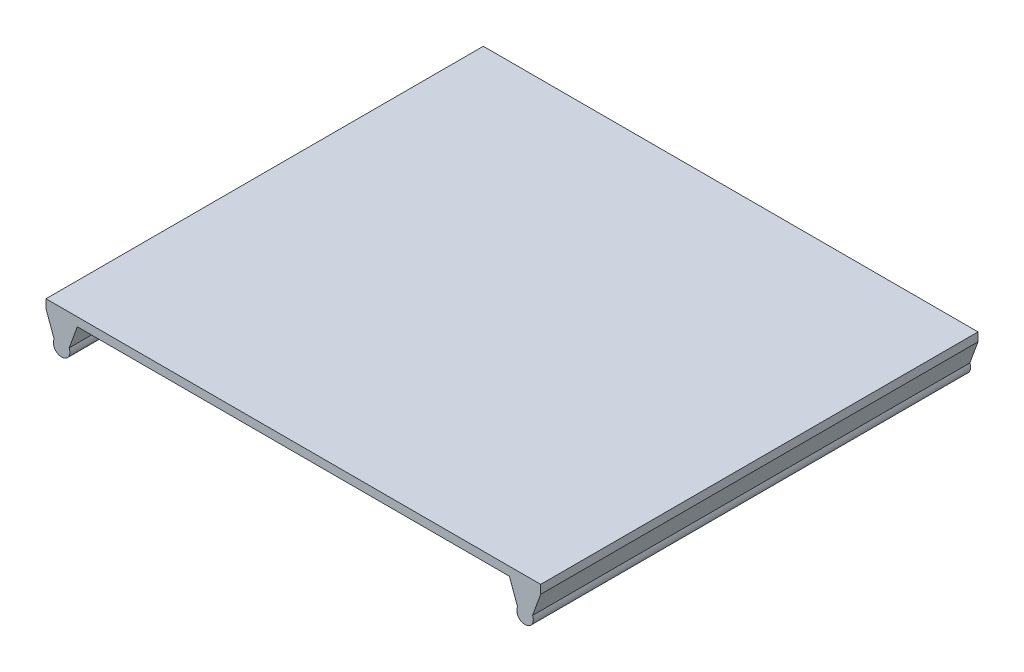
ISO-10303-21;
HEADER;
FILE_DESCRIPTION(('STEP AP214'),'2;1');
FILE_NAME('part.step','',(''),(''),'','','');
FILE_SCHEMA(('AUTOMOTIVE_DESIGN { 1 0 10303 214 1 1 1 1 }'));
ENDSEC;
DATA;
#1=APPLICATION_CONTEXT('core data for automotive mechanical design processes');
#2=APPLICATION_PROTOCOL_DEFINITION('international standard','automotive_design',2000,#1);
#3=PRODUCT_CONTEXT('',#1,'mechanical');
#4=PRODUCT('Part','Part','',(#3));
#5=PRODUCT_RELATED_PRODUCT_CATEGORY('part','',(#4));
#6=PRODUCT_DEFINITION_FORMATION('','',#4);
#7=PRODUCT_DEFINITION_CONTEXT('part definition',#1,'design');
#8=PRODUCT_DEFINITION('design','',#6,#7);
#9=PRODUCT_DEFINITION_SHAPE('','',#8);
#10=(LENGTH_UNIT() NAMED_UNIT(*) SI_UNIT(.MILLI.,.METRE.));
#11=(NAMED_UNIT(*) PLANE_ANGLE_UNIT() SI_UNIT($,.RADIAN.));
#12=(NAMED_UNIT(*) SI_UNIT($,.STERADIAN.) SOLID_ANGLE_UNIT());
#13=UNCERTAINTY_MEASURE_WITH_UNIT(LENGTH_MEASURE(1.E-05),#10,'distance_accuracy_value','');
#14=(GEOMETRIC_REPRESENTATION_CONTEXT(3) GLOBAL_UNCERTAINTY_ASSIGNED_CONTEXT((#13)) GLOBAL_UNIT_ASSIGNED_CONTEXT((#10,
#11,#12)) REPRESENTATION_CONTEXT('',''));
#15=CARTESIAN_POINT('',(0.,0.,0.));
#16=DIRECTION('',(0.,0.,1.));
#17=DIRECTION('',(1.,0.,0.));
#18=AXIS2_PLACEMENT_3D('',#15,#16,#17);
#19=CARTESIAN_POINT('',(234.445641948457,85.3312352226725,254.));
#20=DIRECTION('',(0.939692620785905,0.342020143325678,0.));
#21=DIRECTION('',(-0.342020143325678,0.939692620785905,0.));
#22=AXIS2_PLACEMENT_3D('',#19,#20,#21);
#23=PLANE('',#22);
#24=DIRECTION('',(0.342020143325678,-0.939692620785905,0.));
#25=VECTOR('',#24,1.);
#26=CARTESIAN_POINT('',(234.445641948457,85.3312352226725,0.));
#27=LINE('',#26,#25);
#28=CARTESIAN_POINT('',(260.044118108685,15.,0.));
#29=VERTEX_POINT('',#28);
#30=CARTESIAN_POINT('',(264.775731154146,2.,0.));
#31=VERTEX_POINT('',#30);
#32=EDGE_CURVE('E180',#29,#31,#27,.T.);
#33=ORIENTED_EDGE('',*,*,#32,.T.);
#34=DIRECTION('',(0.,0.,-1.));
#35=VECTOR('',#34,1.);
#36=CARTESIAN_POINT('',(264.775731154146,2.,254.));
#37=LINE('',#36,#35);
#38=CARTESIAN_POINT('',(264.775731154146,2.,254.));
#39=VERTEX_POINT('',#38);
#40=EDGE_CURVE('E12',#39,#31,#37,.T.);
#41=ORIENTED_EDGE('',*,*,#40,.F.);
#42=DIRECTION('',(0.342020143325678,-0.939692620785905,0.));
#43=VECTOR('',#42,1.);
#44=CARTESIAN_POINT('',(234.445641948457,85.3312352226725,254.));
#45=LINE('',#44,#43);
#46=CARTESIAN_POINT('',(260.044118108685,15.,254.));
#47=VERTEX_POINT('',#46);
#48=EDGE_CURVE('E201',#47,#39,#45,.T.);
#49=ORIENTED_EDGE('',*,*,#48,.F.);
#50=DIRECTION('',(0.,0.,-1.));
#51=VECTOR('',#50,1.);
#52=CARTESIAN_POINT('',(260.044118108685,15.,254.));
#53=LINE('',#52,#51);
#54=EDGE_CURVE('E176',#47,#29,#53,.T.);
#55=ORIENTED_EDGE('',*,*,#54,.T.);
#56=EDGE_LOOP('',(#33,#41,#49,#55));
#57=FACE_BOUND('',#56,.T.);
#58=ADVANCED_FACE('F70',(#57),#23,.F.);
#59=CARTESIAN_POINT('',(240.866174893741,-87.6681181028774,254.));
#60=DIRECTION('',(-0.93969262078591,0.342020143325663,0.));
#61=DIRECTION('',(-0.342020143325663,-0.93969262078591,0.));
#62=AXIS2_PLACEMENT_3D('',#59,#60,#61);
#63=PLANE('',#62);
#64=DIRECTION('',(0.342020143325663,0.93969262078591,0.));
#65=VECTOR('',#64,1.);
#66=CARTESIAN_POINT('',(240.866174893741,-87.6681181028774,0.));
#67=LINE('',#66,#65);
#68=CARTESIAN_POINT('',(273.502700845854,2.,0.));
#69=VERTEX_POINT('',#68);
#70=CARTESIAN_POINT('',(278.234313891315,15.,0.));
#71=VERTEX_POINT('',#70);
#72=EDGE_CURVE('E182',#69,#71,#67,.T.);
#73=ORIENTED_EDGE('',*,*,#72,.T.);
#74=DIRECTION('',(0.,0.,-1.));
#75=VECTOR('',#74,1.);
#76=CARTESIAN_POINT('',(278.234313891315,15.,254.));
#77=LINE('',#76,#75);
#78=CARTESIAN_POINT('',(278.234313891315,15.,254.));
#79=VERTEX_POINT('',#78);
#80=EDGE_CURVE('E211',#79,#71,#77,.T.);
#81=ORIENTED_EDGE('',*,*,#80,.F.);
#82=DIRECTION('',(0.342020143325663,0.93969262078591,0.));
#83=VECTOR('',#82,1.);
#84=CARTESIAN_POINT('',(240.866174893741,-87.6681181028774,254.));
#85=LINE('',#84,#83);
#86=CARTESIAN_POINT('',(273.502700845854,2.,254.));
#87=VERTEX_POINT('',#86);
#88=EDGE_CURVE('E371',#87,#79,#85,.T.);
#89=ORIENTED_EDGE('',*,*,#88,.F.);
#90=DIRECTION('',(0.,0.,-1.));
#91=VECTOR('',#90,1.);
#92=CARTESIAN_POINT('',(273.502700845854,2.,254.));
#93=LINE('',#92,#91);
#94=EDGE_CURVE('E80',#87,#69,#93,.T.);
#95=ORIENTED_EDGE('',*,*,#94,.T.);
#96=EDGE_LOOP('',(#73,#81,#89,#95));
#97=FACE_BOUND('',#96,.T.);
#98=ADVANCED_FACE('F238',(#97),#63,.F.);
#99=CARTESIAN_POINT('',(278.234313891315,3.08902141522921E-12,254.));
#100=DIRECTION('',(-1.,0.,0.));
#101=DIRECTION('',(0.,-1.,0.));
#102=AXIS2_PLACEMENT_3D('',#99,#100,#101);
#103=PLANE('',#102);
#104=DIRECTION('',(0.,1.,0.));
#105=VECTOR('',#104,1.);
#106=CARTESIAN_POINT('',(278.234313891315,3.08902141522921E-12,0.));
#107=LINE('',#106,#105);
#108=CARTESIAN_POINT('',(278.234313891315,20.,0.));
#109=VERTEX_POINT('',#108);
#110=EDGE_CURVE('E185',#71,#109,#107,.T.);
#111=ORIENTED_EDGE('',*,*,#110,.T.);
#112=DIRECTION('',(0.,0.,-1.));
#113=VECTOR('',#112,1.);
#114=CARTESIAN_POINT('',(278.234313891315,20.,254.));
#115=LINE('',#114,#113);
#116=CARTESIAN_POINT('',(278.234313891315,20.,254.));
#117=VERTEX_POINT('',#116);
#118=EDGE_CURVE('E209',#117,#109,#115,.T.);
#119=ORIENTED_EDGE('',*,*,#118,.F.);
#120=DIRECTION('',(0.,1.,0.));
#121=VECTOR('',#120,1.);
#122=CARTESIAN_POINT('',(278.234313891315,3.08902141522921E-12,254.));
#123=LINE('',#122,#121);
#124=EDGE_CURVE('E369',#79,#117,#123,.T.);
#125=ORIENTED_EDGE('',*,*,#124,.F.);
#126=ORIENTED_EDGE('',*,*,#80,.T.);
#127=EDGE_LOOP('',(#111,#119,#125,#126));
#128=FACE_BOUND('',#127,.T.);
#129=ADVANCED_FACE('F242',(#128),#103,.F.);
#130=CARTESIAN_POINT('',(0.,20.,254.));
#131=DIRECTION('',(0.,1.,0.));
#132=DIRECTION('',(0.,0.,1.));
#133=AXIS2_PLACEMENT_3D('',#130,#131,#132);
#134=PLANE('',#133);
#135=DIRECTION('',(1.,0.,0.));
#136=VECTOR('',#135,1.);
#137=CARTESIAN_POINT('',(0.,20.,0.));
#138=LINE('',#137,#136);
#139=CARTESIAN_POINT('',(-9.09509789131474,20.,0.));
#140=VERTEX_POINT('',#139);
#141=EDGE_CURVE('E188',#140,#109,#138,.T.);
#142=ORIENTED_EDGE('',*,*,#141,.F.);
#143=DIRECTION('',(0.,0.,-1.));
#144=VECTOR('',#143,1.);
#145=CARTESIAN_POINT('',(-9.09509789131474,20.,254.));
#146=LINE('',#145,#144);
#147=CARTESIAN_POINT('',(-9.09509789131474,20.,254.));
#148=VERTEX_POINT('',#147);
#149=EDGE_CURVE('E207',#148,#140,#146,.T.);
#150=ORIENTED_EDGE('',*,*,#149,.F.);
#151=DIRECTION('',(1.,0.,0.));
#152=VECTOR('',#151,1.);
#153=CARTESIAN_POINT('',(0.,20.,254.));
#154=LINE('',#153,#152);
#155=EDGE_CURVE('E366',#148,#117,#154,.T.);
#156=ORIENTED_EDGE('',*,*,#155,.T.);
#157=ORIENTED_EDGE('',*,*,#118,.T.);
#158=EDGE_LOOP('',(#142,#150,#156,#157));
#159=FACE_BOUND('',#158,.T.);
#160=ADVANCED_FACE('F248',(#159),#134,.T.);
#161=CARTESIAN_POINT('',(-9.09509789131484,0.,254.));
#162=DIRECTION('',(-1.,0.,0.));
#163=DIRECTION('',(0.,-1.,0.));
#164=AXIS2_PLACEMENT_3D('',#161,#162,#163);
#165=PLANE('',#164);
#166=DIRECTION('',(0.,1.,0.));
#167=VECTOR('',#166,1.);
#168=CARTESIAN_POINT('',(-9.09509789131484,0.,0.));
#169=LINE('',#168,#167);
#170=CARTESIAN_POINT('',(-9.09509789131477,15.,0.));
#171=VERTEX_POINT('',#170);
#172=EDGE_CURVE('E191',#171,#140,#169,.T.);
#173=ORIENTED_EDGE('',*,*,#172,.F.);
#174=DIRECTION('',(0.,0.,-1.));
#175=VECTOR('',#174,1.);
#176=CARTESIAN_POINT('',(-9.09509789131477,15.,254.));
#177=LINE('',#176,#175);
#178=CARTESIAN_POINT('',(-9.09509789131477,15.,254.));
#179=VERTEX_POINT('',#178);
#180=EDGE_CURVE('E205',#179,#171,#177,.T.);
#181=ORIENTED_EDGE('',*,*,#180,.F.);
#182=DIRECTION('',(0.,1.,0.));
#183=VECTOR('',#182,1.);
#184=CARTESIAN_POINT('',(-9.09509789131484,0.,254.));
#185=LINE('',#184,#183);
#186=EDGE_CURVE('E362',#179,#148,#185,.T.);
#187=ORIENTED_EDGE('',*,*,#186,.T.);
#188=ORIENTED_EDGE('',*,*,#149,.T.);
#189=EDGE_LOOP('',(#173,#181,#187,#188));
#190=FACE_BOUND('',#189,.T.);
#191=ADVANCED_FACE('F252',(#190),#165,.T.);
#192=CARTESIAN_POINT('',(-3.21026647264092,-1.16844144010401,254.));
#193=DIRECTION('',(-0.939692620785912,-0.342020143325659,0.));
#194=DIRECTION('',(0.342020143325659,-0.939692620785912,0.));
#195=AXIS2_PLACEMENT_3D('',#192,#193,#194);
#196=PLANE('',#195);
#197=DIRECTION('',(-0.342020143325659,0.939692620785912,0.));
#198=VECTOR('',#197,1.);
#199=CARTESIAN_POINT('',(-3.21026647264092,-1.16844144010401,0.));
#200=LINE('',#199,#198);
#201=CARTESIAN_POINT('',(-4.36348484585428,2.,0.));
#202=VERTEX_POINT('',#201);
#203=EDGE_CURVE('E194',#202,#171,#200,.T.);
#204=ORIENTED_EDGE('',*,*,#203,.F.);
#205=DIRECTION('',(0.,0.,-1.));
#206=VECTOR('',#205,1.);
#207=CARTESIAN_POINT('',(-4.36348484585428,2.,254.));
#208=LINE('',#207,#206);
#209=CARTESIAN_POINT('',(-4.36348484585428,2.,254.));
#210=VERTEX_POINT('',#209);
#211=EDGE_CURVE('E172',#210,#202,#208,.T.);
#212=ORIENTED_EDGE('',*,*,#211,.F.);
#213=DIRECTION('',(-0.342020143325659,0.939692620785912,0.));
#214=VECTOR('',#213,1.);
#215=CARTESIAN_POINT('',(-3.21026647264092,-1.16844144010401,254.));
#216=LINE('',#215,#214);
#217=EDGE_CURVE('E161',#210,#179,#216,.T.);
#218=ORIENTED_EDGE('',*,*,#217,.T.);
#219=ORIENTED_EDGE('',*,*,#180,.T.);
#220=EDGE_LOOP('',(#204,#212,#218,#219));
#221=FACE_BOUND('',#220,.T.);
#222=ADVANCED_FACE('F256',(#221),#196,.T.);
#223=CARTESIAN_POINT('',(0.,0.,254.));
#224=DIRECTION('',(0.,0.,-1.));
#225=DIRECTION('',(-1.,0.,0.));
#226=AXIS2_PLACEMENT_3D('',#223,#224,#225);
#227=CYLINDRICAL_SURFACE('',#226,4.8);
#228=CARTESIAN_POINT('',(0.,0.,0.));
#229=DIRECTION('',(0.,0.,1.));
#230=DIRECTION('',(1.,0.,0.));
#231=AXIS2_PLACEMENT_3D('',#228,#229,#230);
#232=CIRCLE('',#231,4.8);
#233=CARTESIAN_POINT('',(4.36348484585428,2.,0.));
#234=VERTEX_POINT('',#233);
#235=EDGE_CURVE('E168',#202,#234,#232,.T.);
#236=ORIENTED_EDGE('',*,*,#235,.T.);
#237=DIRECTION('',(0.,0.,-1.));
#238=VECTOR('',#237,1.);
#239=CARTESIAN_POINT('',(4.36348484585428,2.,254.));
#240=LINE('',#239,#238);
#241=CARTESIAN_POINT('',(4.36348484585428,2.,254.));
#242=VERTEX_POINT('',#241);
#243=EDGE_CURVE('E165',#242,#234,#240,.T.);
#244=ORIENTED_EDGE('',*,*,#243,.F.);
#245=CARTESIAN_POINT('',(0.,0.,254.));
#246=DIRECTION('',(0.,0.,1.));
#247=DIRECTION('',(1.,0.,0.));
#248=AXIS2_PLACEMENT_3D('',#245,#246,#247);
#249=CIRCLE('',#248,4.8);
#250=EDGE_CURVE('E154',#210,#242,#249,.T.);
#251=ORIENTED_EDGE('',*,*,#250,.F.);
#252=ORIENTED_EDGE('',*,*,#211,.T.);
#253=EDGE_LOOP('',(#236,#244,#251,#252));
#254=FACE_BOUND('',#253,.T.);
#255=ADVANCED_FACE('F166',(#254),#227,.T.);
#256=CARTESIAN_POINT('',(3.21026647264086,-1.16844144010404,254.));
#257=DIRECTION('',(0.939692620785907,-0.342020143325673,0.));
#258=DIRECTION('',(0.342020143325673,0.939692620785907,0.));
#259=AXIS2_PLACEMENT_3D('',#256,#257,#258);
#260=PLANE('',#259);
#261=DIRECTION('',(-0.342020143325673,-0.939692620785907,0.));
#262=VECTOR('',#261,1.);
#263=CARTESIAN_POINT('',(3.21026647264086,-1.16844144010404,0.));
#264=LINE('',#263,#262);
#265=CARTESIAN_POINT('',(9.09509789131499,15.,0.));
#266=VERTEX_POINT('',#265);
#267=EDGE_CURVE('E198',#266,#234,#264,.T.);
#268=ORIENTED_EDGE('',*,*,#267,.F.);
#269=DIRECTION('',(0.,0.,-1.));
#270=VECTOR('',#269,1.);
#271=CARTESIAN_POINT('',(9.09509789131499,15.,254.));
#272=LINE('',#271,#270);
#273=CARTESIAN_POINT('',(9.09509789131499,15.,254.));
#274=VERTEX_POINT('',#273);
#275=EDGE_CURVE('E122',#274,#266,#272,.T.);
#276=ORIENTED_EDGE('',*,*,#275,.F.);
#277=DIRECTION('',(-0.342020143325673,-0.939692620785907,0.));
#278=VECTOR('',#277,1.);
#279=CARTESIAN_POINT('',(3.21026647264086,-1.16844144010404,254.));
#280=LINE('',#279,#278);
#281=EDGE_CURVE('E158',#274,#242,#280,.T.);
#282=ORIENTED_EDGE('',*,*,#281,.T.);
#283=ORIENTED_EDGE('',*,*,#243,.T.);
#284=EDGE_LOOP('',(#268,#276,#282,#283));
#285=FACE_BOUND('',#284,.T.);
#286=ADVANCED_FACE('F174',(#285),#260,.T.);
#287=CARTESIAN_POINT('',(0.,15.,254.));
#288=DIRECTION('',(0.,1.,0.));
#289=DIRECTION('',(0.,0.,1.));
#290=AXIS2_PLACEMENT_3D('',#287,#288,#289);
#291=PLANE('',#290);
#292=DIRECTION('',(1.,0.,0.));
#293=VECTOR('',#292,1.);
#294=CARTESIAN_POINT('',(0.,15.,0.));
#295=LINE('',#294,#293);
#296=EDGE_CURVE('E125',#266,#29,#295,.T.);
#297=ORIENTED_EDGE('',*,*,#296,.T.);
#298=ORIENTED_EDGE('',*,*,#54,.F.);
#299=DIRECTION('',(1.,0.,0.));
#300=VECTOR('',#299,1.);
#301=CARTESIAN_POINT('',(0.,15.,254.));
#302=LINE('',#301,#300);
#303=EDGE_CURVE('E89',#274,#47,#302,.T.);
#304=ORIENTED_EDGE('',*,*,#303,.F.);
#305=ORIENTED_EDGE('',*,*,#275,.T.);
#306=EDGE_LOOP('',(#297,#298,#304,#305));
#307=FACE_BOUND('',#306,.T.);
#308=ADVANCED_FACE('F223',(#307),#291,.F.);
#309=CARTESIAN_POINT('',(0.,0.,254.));
#310=DIRECTION('',(0.,0.,1.));
#311=DIRECTION('',(1.,0.,0.));
#312=AXIS2_PLACEMENT_3D('',#309,#310,#311);
#313=PLANE('',#312);
#314=ORIENTED_EDGE('',*,*,#48,.T.);
#315=CARTESIAN_POINT('',(269.139216,0.,254.));
#316=DIRECTION('',(0.,0.,-1.));
#317=DIRECTION('',(-1.,0.,0.));
#318=AXIS2_PLACEMENT_3D('',#315,#316,#317);
#319=CIRCLE('',#318,4.8);
#320=EDGE_CURVE('E183',#87,#39,#319,.T.);
#321=ORIENTED_EDGE('',*,*,#320,.F.);
#322=ORIENTED_EDGE('',*,*,#88,.T.);
#323=ORIENTED_EDGE('',*,*,#124,.T.);
#324=ORIENTED_EDGE('',*,*,#155,.F.);
#325=ORIENTED_EDGE('',*,*,#186,.F.);
#326=ORIENTED_EDGE('',*,*,#217,.F.);
#327=ORIENTED_EDGE('',*,*,#250,.T.);
#328=ORIENTED_EDGE('',*,*,#281,.F.);
#329=ORIENTED_EDGE('',*,*,#303,.T.);
#330=EDGE_LOOP('',(#314,#321,#322,#323,#324,#325,#326,#327,#328,#329));
#331=FACE_BOUND('',#330,.T.);
#332=ADVANCED_FACE('F156',(#331),#313,.T.);
#333=CARTESIAN_POINT('',(0.,0.,0.));
#334=DIRECTION('',(0.,0.,1.));
#335=DIRECTION('',(1.,0.,0.));
#336=AXIS2_PLACEMENT_3D('',#333,#334,#335);
#337=PLANE('',#336);
#338=ORIENTED_EDGE('',*,*,#32,.F.);
#339=ORIENTED_EDGE('',*,*,#296,.F.);
#340=ORIENTED_EDGE('',*,*,#267,.T.);
#341=ORIENTED_EDGE('',*,*,#235,.F.);
#342=ORIENTED_EDGE('',*,*,#203,.T.);
#343=ORIENTED_EDGE('',*,*,#172,.T.);
#344=ORIENTED_EDGE('',*,*,#141,.T.);
#345=ORIENTED_EDGE('',*,*,#110,.F.);
#346=ORIENTED_EDGE('',*,*,#72,.F.);
#347=CARTESIAN_POINT('',(269.139216,0.,0.));
#348=DIRECTION('',(0.,0.,-1.));
#349=DIRECTION('',(-1.,0.,0.));
#350=AXIS2_PLACEMENT_3D('',#347,#348,#349);
#351=CIRCLE('',#350,4.8);
#352=EDGE_CURVE('E74',#69,#31,#351,.T.);
#353=ORIENTED_EDGE('',*,*,#352,.T.);
#354=EDGE_LOOP('',(#338,#339,#340,#341,#342,#343,#344,#345,#346,#353));
#355=FACE_BOUND('',#354,.T.);
#356=ADVANCED_FACE('F221',(#355),#337,.F.);
#357=CARTESIAN_POINT('',(269.139216,0.,254.));
#358=DIRECTION('',(0.,0.,-1.));
#359=DIRECTION('',(-1.,0.,0.));
#360=AXIS2_PLACEMENT_3D('',#357,#358,#359);
#361=CYLINDRICAL_SURFACE('',#360,4.8);
#362=ORIENTED_EDGE('',*,*,#40,.T.);
#363=ORIENTED_EDGE('',*,*,#352,.F.);
#364=ORIENTED_EDGE('',*,*,#94,.F.);
#365=ORIENTED_EDGE('',*,*,#320,.T.);
#366=EDGE_LOOP('',(#362,#363,#364,#365));
#367=FACE_BOUND('',#366,.T.);
#368=ADVANCED_FACE('F72',(#367),#361,.T.);
#369=CLOSED_SHELL('',(#58,#98,#129,#160,#191,#222,#255,#286,#308,#332,#356,#368));
#370=MANIFOLD_SOLID_BREP('B2',#369);
#371=ADVANCED_BREP_SHAPE_REPRESENTATION('',(#18,#370),#14);
#372=SHAPE_DEFINITION_REPRESENTATION(#9,#371);
ENDSEC;
END-ISO-10303-21;
